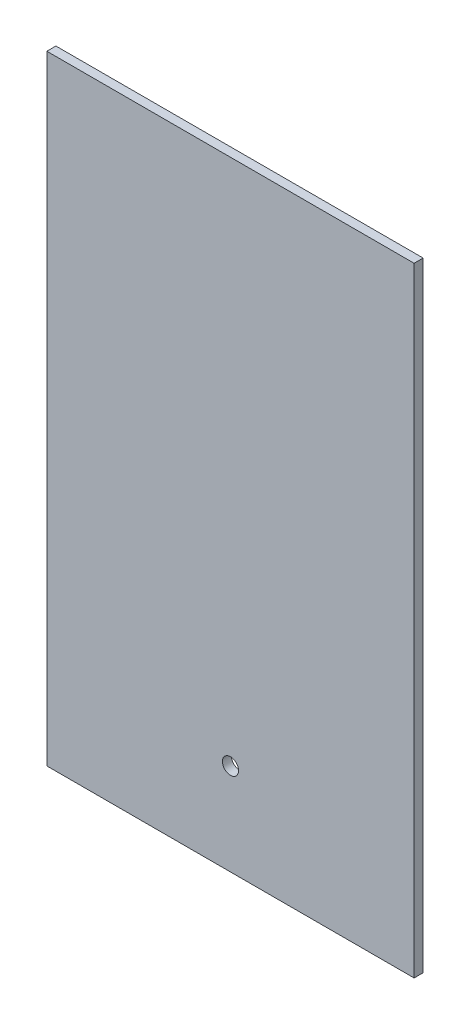
ISO-10303-21;
HEADER;
FILE_DESCRIPTION(('STEP AP214'),'2;1');
FILE_NAME('part.step','',(''),(''),'','','');
FILE_SCHEMA(('AUTOMOTIVE_DESIGN { 1 0 10303 214 1 1 1 1 }'));
ENDSEC;
DATA;
#1=APPLICATION_CONTEXT('core data for automotive mechanical design processes');
#2=APPLICATION_PROTOCOL_DEFINITION('international standard','automotive_design',2000,#1);
#3=PRODUCT_CONTEXT('',#1,'mechanical');
#4=PRODUCT('Part','Part','',(#3));
#5=PRODUCT_RELATED_PRODUCT_CATEGORY('part','',(#4));
#6=PRODUCT_DEFINITION_FORMATION('','',#4);
#7=PRODUCT_DEFINITION_CONTEXT('part definition',#1,'design');
#8=PRODUCT_DEFINITION('design','',#6,#7);
#9=PRODUCT_DEFINITION_SHAPE('','',#8);
#10=(LENGTH_UNIT() NAMED_UNIT(*) SI_UNIT(.MILLI.,.METRE.));
#11=(NAMED_UNIT(*) PLANE_ANGLE_UNIT() SI_UNIT($,.RADIAN.));
#12=(NAMED_UNIT(*) SI_UNIT($,.STERADIAN.) SOLID_ANGLE_UNIT());
#13=UNCERTAINTY_MEASURE_WITH_UNIT(LENGTH_MEASURE(1.E-05),#10,'distance_accuracy_value','');
#14=(GEOMETRIC_REPRESENTATION_CONTEXT(3) GLOBAL_UNCERTAINTY_ASSIGNED_CONTEXT((#13)) GLOBAL_UNIT_ASSIGNED_CONTEXT((#10,
#11,#12)) REPRESENTATION_CONTEXT('',''));
#15=CARTESIAN_POINT('',(0.,0.,0.));
#16=DIRECTION('',(0.,0.,1.));
#17=DIRECTION('',(1.,0.,0.));
#18=AXIS2_PLACEMENT_3D('',#15,#16,#17);
#19=CARTESIAN_POINT('',(56.9,-95.9,1.4));
#20=DIRECTION('',(0.,1.,0.));
#21=DIRECTION('',(0.,0.,1.));
#22=AXIS2_PLACEMENT_3D('',#19,#20,#21);
#23=PLANE('',#22);
#24=DIRECTION('',(1.,0.,0.));
#25=VECTOR('',#24,1.);
#26=CARTESIAN_POINT('',(56.9,-95.9,-1.4));
#27=LINE('',#26,#25);
#28=CARTESIAN_POINT('',(-56.9,-95.9,-1.4));
#29=VERTEX_POINT('',#28);
#30=CARTESIAN_POINT('',(56.9,-95.9,-1.4));
#31=VERTEX_POINT('',#30);
#32=EDGE_CURVE('E102',#29,#31,#27,.T.);
#33=ORIENTED_EDGE('',*,*,#32,.T.);
#34=DIRECTION('',(0.,0.,-1.));
#35=VECTOR('',#34,1.);
#36=CARTESIAN_POINT('',(56.9,-95.9,1.4));
#37=LINE('',#36,#35);
#38=CARTESIAN_POINT('',(56.9,-95.9,1.4));
#39=VERTEX_POINT('',#38);
#40=EDGE_CURVE('E11',#39,#31,#37,.T.);
#41=ORIENTED_EDGE('',*,*,#40,.F.);
#42=DIRECTION('',(1.,0.,0.));
#43=VECTOR('',#42,1.);
#44=CARTESIAN_POINT('',(56.9,-95.9,1.4));
#45=LINE('',#44,#43);
#46=CARTESIAN_POINT('',(-56.9,-95.9,1.4));
#47=VERTEX_POINT('',#46);
#48=EDGE_CURVE('E90',#47,#39,#45,.T.);
#49=ORIENTED_EDGE('',*,*,#48,.F.);
#50=DIRECTION('',(0.,0.,-1.));
#51=VECTOR('',#50,1.);
#52=CARTESIAN_POINT('',(-56.9,-95.9,1.4));
#53=LINE('',#52,#51);
#54=EDGE_CURVE('E98',#47,#29,#53,.T.);
#55=ORIENTED_EDGE('',*,*,#54,.T.);
#56=EDGE_LOOP('',(#33,#41,#49,#55));
#57=FACE_BOUND('',#56,.T.);
#58=ADVANCED_FACE('F39',(#57),#23,.F.);
#59=CARTESIAN_POINT('',(56.9,95.9,1.4));
#60=DIRECTION('',(-1.,0.,0.));
#61=DIRECTION('',(0.,-1.,0.));
#62=AXIS2_PLACEMENT_3D('',#59,#60,#61);
#63=PLANE('',#62);
#64=DIRECTION('',(0.,1.,0.));
#65=VECTOR('',#64,1.);
#66=CARTESIAN_POINT('',(56.9,95.9,-1.4));
#67=LINE('',#66,#65);
#68=CARTESIAN_POINT('',(56.9,95.9,-1.4));
#69=VERTEX_POINT('',#68);
#70=EDGE_CURVE('E94',#31,#69,#67,.T.);
#71=ORIENTED_EDGE('',*,*,#70,.T.);
#72=DIRECTION('',(0.,0.,-1.));
#73=VECTOR('',#72,1.);
#74=CARTESIAN_POINT('',(56.9,95.9,1.4));
#75=LINE('',#74,#73);
#76=CARTESIAN_POINT('',(56.9,95.9,1.4));
#77=VERTEX_POINT('',#76);
#78=EDGE_CURVE('E47',#77,#69,#75,.T.);
#79=ORIENTED_EDGE('',*,*,#78,.F.);
#80=DIRECTION('',(0.,1.,0.));
#81=VECTOR('',#80,1.);
#82=CARTESIAN_POINT('',(56.9,95.9,1.4));
#83=LINE('',#82,#81);
#84=EDGE_CURVE('E85',#39,#77,#83,.T.);
#85=ORIENTED_EDGE('',*,*,#84,.F.);
#86=ORIENTED_EDGE('',*,*,#40,.T.);
#87=EDGE_LOOP('',(#71,#79,#85,#86));
#88=FACE_BOUND('',#87,.T.);
#89=ADVANCED_FACE('F93',(#88),#63,.F.);
#90=CARTESIAN_POINT('',(56.9,95.9,1.4));
#91=DIRECTION('',(0.,-1.,0.));
#92=DIRECTION('',(0.,0.,-1.));
#93=AXIS2_PLACEMENT_3D('',#90,#91,#92);
#94=PLANE('',#93);
#95=DIRECTION('',(-1.,0.,0.));
#96=VECTOR('',#95,1.);
#97=CARTESIAN_POINT('',(56.9,95.9,-1.4));
#98=LINE('',#97,#96);
#99=CARTESIAN_POINT('',(-56.9,95.9,-1.4));
#100=VERTEX_POINT('',#99);
#101=EDGE_CURVE('E72',#69,#100,#98,.T.);
#102=ORIENTED_EDGE('',*,*,#101,.T.);
#103=DIRECTION('',(0.,0.,-1.));
#104=VECTOR('',#103,1.);
#105=CARTESIAN_POINT('',(-56.9,95.9,1.4));
#106=LINE('',#105,#104);
#107=CARTESIAN_POINT('',(-56.9,95.9,1.4));
#108=VERTEX_POINT('',#107);
#109=EDGE_CURVE('E95',#108,#100,#106,.T.);
#110=ORIENTED_EDGE('',*,*,#109,.F.);
#111=DIRECTION('',(-1.,0.,0.));
#112=VECTOR('',#111,1.);
#113=CARTESIAN_POINT('',(56.9,95.9,1.4));
#114=LINE('',#113,#112);
#115=EDGE_CURVE('E88',#77,#108,#114,.T.);
#116=ORIENTED_EDGE('',*,*,#115,.F.);
#117=ORIENTED_EDGE('',*,*,#78,.T.);
#118=EDGE_LOOP('',(#102,#110,#116,#117));
#119=FACE_BOUND('',#118,.T.);
#120=ADVANCED_FACE('F96',(#119),#94,.F.);
#121=CARTESIAN_POINT('',(-56.9,95.9,1.4));
#122=DIRECTION('',(1.,0.,0.));
#123=DIRECTION('',(0.,1.,0.));
#124=AXIS2_PLACEMENT_3D('',#121,#122,#123);
#125=PLANE('',#124);
#126=DIRECTION('',(0.,-1.,0.));
#127=VECTOR('',#126,1.);
#128=CARTESIAN_POINT('',(-56.9,95.9,-1.4));
#129=LINE('',#128,#127);
#130=EDGE_CURVE('E78',#100,#29,#129,.T.);
#131=ORIENTED_EDGE('',*,*,#130,.T.);
#132=ORIENTED_EDGE('',*,*,#54,.F.);
#133=DIRECTION('',(0.,-1.,0.));
#134=VECTOR('',#133,1.);
#135=CARTESIAN_POINT('',(-56.9,95.9,1.4));
#136=LINE('',#135,#134);
#137=EDGE_CURVE('E55',#108,#47,#136,.T.);
#138=ORIENTED_EDGE('',*,*,#137,.F.);
#139=ORIENTED_EDGE('',*,*,#109,.T.);
#140=EDGE_LOOP('',(#131,#132,#138,#139));
#141=FACE_BOUND('',#140,.T.);
#142=ADVANCED_FACE('F110',(#141),#125,.F.);
#143=CARTESIAN_POINT('',(0.,0.,1.4));
#144=DIRECTION('',(0.,0.,1.));
#145=DIRECTION('',(1.,0.,0.));
#146=AXIS2_PLACEMENT_3D('',#143,#144,#145);
#147=PLANE('',#146);
#148=CARTESIAN_POINT('',(0.,-67.4681293930824,1.4));
#149=DIRECTION('',(0.,0.,1.));
#150=DIRECTION('',(1.,0.,0.));
#151=AXIS2_PLACEMENT_3D('',#148,#149,#150);
#152=CIRCLE('',#151,2.5);
#153=CARTESIAN_POINT('',(2.5,-67.4681293930824,1.4));
#154=VERTEX_POINT('',#153);
#155=EDGE_CURVE('E116',#154,#154,#152,.T.);
#156=ORIENTED_EDGE('',*,*,#155,.F.);
#157=EDGE_LOOP('',(#156));
#158=FACE_BOUND('',#157,.T.);
#159=ORIENTED_EDGE('',*,*,#48,.T.);
#160=ORIENTED_EDGE('',*,*,#84,.T.);
#161=ORIENTED_EDGE('',*,*,#115,.T.);
#162=ORIENTED_EDGE('',*,*,#137,.T.);
#163=EDGE_LOOP('',(#159,#160,#161,#162));
#164=FACE_BOUND('',#163,.T.);
#165=ADVANCED_FACE('F86',(#158,#164),#147,.T.);
#166=CARTESIAN_POINT('',(0.,0.,-1.4));
#167=DIRECTION('',(0.,0.,1.));
#168=DIRECTION('',(1.,0.,0.));
#169=AXIS2_PLACEMENT_3D('',#166,#167,#168);
#170=PLANE('',#169);
#171=CARTESIAN_POINT('',(0.,-67.4681293930824,-1.4));
#172=DIRECTION('',(0.,0.,1.));
#173=DIRECTION('',(1.,0.,0.));
#174=AXIS2_PLACEMENT_3D('',#171,#172,#173);
#175=CIRCLE('',#174,2.5);
#176=CARTESIAN_POINT('',(2.5,-67.4681293930824,-1.4));
#177=VERTEX_POINT('',#176);
#178=EDGE_CURVE('E105',#177,#177,#175,.T.);
#179=ORIENTED_EDGE('',*,*,#178,.T.);
#180=EDGE_LOOP('',(#179));
#181=FACE_BOUND('',#180,.T.);
#182=ORIENTED_EDGE('',*,*,#32,.F.);
#183=ORIENTED_EDGE('',*,*,#130,.F.);
#184=ORIENTED_EDGE('',*,*,#101,.F.);
#185=ORIENTED_EDGE('',*,*,#70,.F.);
#186=EDGE_LOOP('',(#182,#183,#184,#185));
#187=FACE_BOUND('',#186,.T.);
#188=ADVANCED_FACE('F113',(#181,#187),#170,.F.);
#189=CARTESIAN_POINT('',(0.,-67.4681293930824,-1.4));
#190=DIRECTION('',(0.,0.,1.));
#191=DIRECTION('',(1.,0.,0.));
#192=AXIS2_PLACEMENT_3D('',#189,#190,#191);
#193=CYLINDRICAL_SURFACE('',#192,2.5);
#194=ORIENTED_EDGE('',*,*,#178,.F.);
#195=EDGE_LOOP('',(#194));
#196=FACE_BOUND('',#195,.T.);
#197=ORIENTED_EDGE('',*,*,#155,.T.);
#198=EDGE_LOOP('',(#197));
#199=FACE_BOUND('',#198,.T.);
#200=ADVANCED_FACE('F123',(#196,#199),#193,.F.);
#201=CLOSED_SHELL('',(#58,#89,#120,#142,#165,#188,#200));
#202=MANIFOLD_SOLID_BREP('B2',#201);
#203=ADVANCED_BREP_SHAPE_REPRESENTATION('',(#18,#202),#14);
#204=SHAPE_DEFINITION_REPRESENTATION(#9,#203);
ENDSEC;
END-ISO-10303-21;
